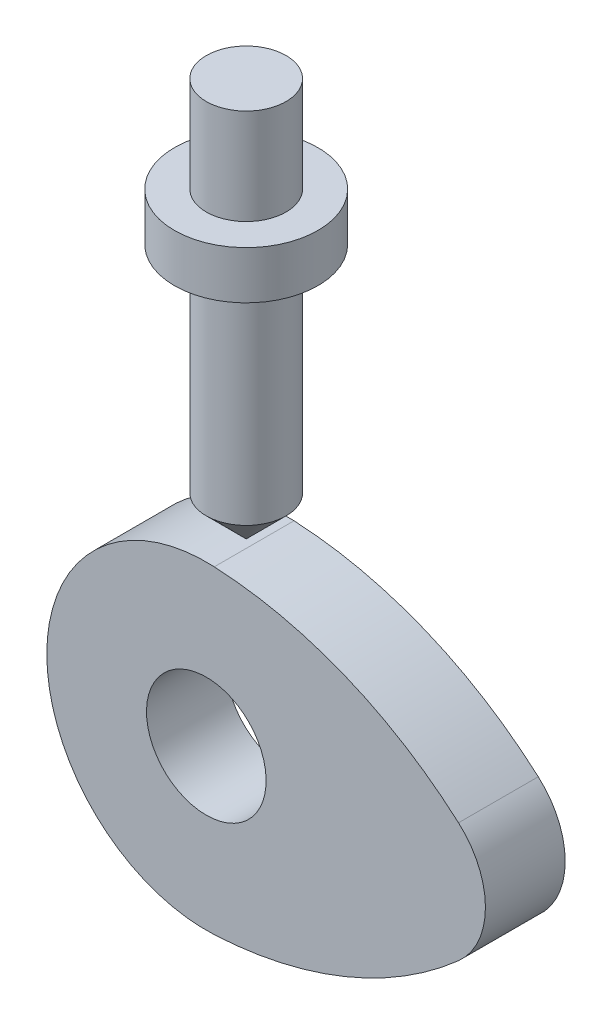
ISO-10303-21;
HEADER;
FILE_DESCRIPTION(('STEP AP214'),'2;1');
FILE_NAME('part.step','',(''),(''),'','','');
FILE_SCHEMA(('AUTOMOTIVE_DESIGN { 1 0 10303 214 1 1 1 1 }'));
ENDSEC;
DATA;
#1=APPLICATION_CONTEXT('core data for automotive mechanical design processes');
#2=APPLICATION_PROTOCOL_DEFINITION('international standard','automotive_design',2000,#1);
#3=PRODUCT_CONTEXT('',#1,'mechanical');
#4=PRODUCT('Part','Part','',(#3));
#5=PRODUCT_RELATED_PRODUCT_CATEGORY('part','',(#4));
#6=PRODUCT_DEFINITION_FORMATION('','',#4);
#7=PRODUCT_DEFINITION_CONTEXT('part definition',#1,'design');
#8=PRODUCT_DEFINITION('design','',#6,#7);
#9=PRODUCT_DEFINITION_SHAPE('','',#8);
#10=(LENGTH_UNIT() NAMED_UNIT(*) SI_UNIT(.MILLI.,.METRE.));
#11=(NAMED_UNIT(*) PLANE_ANGLE_UNIT() SI_UNIT($,.RADIAN.));
#12=(NAMED_UNIT(*) SI_UNIT($,.STERADIAN.) SOLID_ANGLE_UNIT());
#13=UNCERTAINTY_MEASURE_WITH_UNIT(LENGTH_MEASURE(1.E-05),#10,'distance_accuracy_value','');
#14=(GEOMETRIC_REPRESENTATION_CONTEXT(3) GLOBAL_UNCERTAINTY_ASSIGNED_CONTEXT((#13)) GLOBAL_UNIT_ASSIGNED_CONTEXT((#10,
#11,#12)) REPRESENTATION_CONTEXT('',''));
#15=CARTESIAN_POINT('',(0.,0.,0.));
#16=DIRECTION('',(0.,0.,1.));
#17=DIRECTION('',(1.,0.,0.));
#18=AXIS2_PLACEMENT_3D('',#15,#16,#17);
#19=CARTESIAN_POINT('',(0.,70.,0.));
#20=DIRECTION('',(0.,-1.,0.));
#21=DIRECTION('',(-0.386613677027447,0.,-0.922241760459435));
#22=AXIS2_PLACEMENT_3D('',#19,#20,#21);
#23=CYLINDRICAL_SURFACE('',#22,5.);
#24=CARTESIAN_POINT('',(0.,25.,0.));
#25=DIRECTION('',(0.,1.,0.));
#26=DIRECTION('',(0.386613677027447,0.,0.922241760459435));
#27=AXIS2_PLACEMENT_3D('',#24,#25,#26);
#28=CIRCLE('',#27,5.);
#29=CARTESIAN_POINT('',(1.93306838513718,25.,4.61120880229723));
#30=VERTEX_POINT('',#29);
#31=EDGE_CURVE('P0_E11',#30,#30,#28,.T.);
#32=ORIENTED_EDGE('',*,*,#31,.T.);
#33=EDGE_LOOP('',(#32));
#34=FACE_BOUND('',#33,.T.);
#35=CARTESIAN_POINT('',(0.,70.,0.));
#36=DIRECTION('',(0.,1.,0.));
#37=DIRECTION('',(0.386613677027447,0.,0.922241760459435));
#38=AXIS2_PLACEMENT_3D('',#35,#36,#37);
#39=CIRCLE('',#38,5.);
#40=CARTESIAN_POINT('',(1.93306838513718,70.,4.61120880229723));
#41=VERTEX_POINT('',#40);
#42=EDGE_CURVE('P0_E25',#41,#41,#39,.T.);
#43=ORIENTED_EDGE('',*,*,#42,.F.);
#44=EDGE_LOOP('',(#43));
#45=FACE_BOUND('',#44,.T.);
#46=ADVANCED_FACE('P0_F17',(#34,#45),#23,.T.);
#47=CARTESIAN_POINT('',(0.,70.,0.));
#48=DIRECTION('',(0.,1.,0.));
#49=DIRECTION('',(0.386613677027447,0.,0.922241760459435));
#50=AXIS2_PLACEMENT_3D('',#47,#48,#49);
#51=PLANE('',#50);
#52=ORIENTED_EDGE('',*,*,#42,.T.);
#53=EDGE_LOOP('',(#52));
#54=FACE_BOUND('',#53,.T.);
#55=ADVANCED_FACE('P0_F30',(#54),#51,.T.);
#56=CARTESIAN_POINT('',(0.,25.,0.));
#57=DIRECTION('',(0.,1.,0.));
#58=DIRECTION('',(0.386613677027447,0.,0.922241760459435));
#59=AXIS2_PLACEMENT_3D('',#56,#57,#58);
#60=CONICAL_SURFACE('',#59,5.00000000000003,0.78539816339745);
#61=CARTESIAN_POINT('',(0.,20.,0.));
#62=VERTEX_POINT('',#61);
#63=VERTEX_LOOP('',#62);
#64=FACE_BOUND('',#63,.T.);
#65=ORIENTED_EDGE('',*,*,#31,.F.);
#66=EDGE_LOOP('',(#65));
#67=FACE_BOUND('',#66,.T.);
#68=ADVANCED_FACE('P0_F20',(#64,#67),#60,.T.);
#69=CLOSED_SHELL('',(#46,#55,#68));
#70=MANIFOLD_SOLID_BREP('P0_B1',#69);
#71=CARTESIAN_POINT('',(0.,58.,0.));
#72=DIRECTION('',(0.,1.,0.));
#73=DIRECTION('',(0.,0.,1.));
#74=AXIS2_PLACEMENT_3D('',#71,#72,#73);
#75=PLANE('',#74);
#76=CARTESIAN_POINT('',(0.,58.,0.));
#77=DIRECTION('',(0.,1.,0.));
#78=DIRECTION('',(0.,0.,1.));
#79=AXIS2_PLACEMENT_3D('',#76,#77,#78);
#80=CIRCLE('',#79,9.);
#81=CARTESIAN_POINT('',(0.,58.,9.));
#82=VERTEX_POINT('',#81);
#83=EDGE_CURVE('P1_E9',#82,#82,#80,.T.);
#84=ORIENTED_EDGE('',*,*,#83,.T.);
#85=EDGE_LOOP('',(#84));
#86=FACE_BOUND('',#85,.T.);
#87=CARTESIAN_POINT('',(0.,58.,0.));
#88=DIRECTION('',(0.,1.,0.));
#89=DIRECTION('',(0.,0.,1.));
#90=AXIS2_PLACEMENT_3D('',#87,#88,#89);
#91=CIRCLE('',#90,5.);
#92=CARTESIAN_POINT('',(0.,58.,5.));
#93=VERTEX_POINT('',#92);
#94=EDGE_CURVE('P1_E25',#93,#93,#91,.T.);
#95=ORIENTED_EDGE('',*,*,#94,.F.);
#96=EDGE_LOOP('',(#95));
#97=FACE_BOUND('',#96,.T.);
#98=ADVANCED_FACE('P1_F14',(#86,#97),#75,.T.);
#99=CARTESIAN_POINT('',(0.,52.,0.));
#100=DIRECTION('',(0.,1.,0.));
#101=DIRECTION('',(0.,0.,1.));
#102=AXIS2_PLACEMENT_3D('',#99,#100,#101);
#103=PLANE('',#102);
#104=CARTESIAN_POINT('',(0.,52.,0.));
#105=DIRECTION('',(0.,1.,0.));
#106=DIRECTION('',(0.,0.,1.));
#107=AXIS2_PLACEMENT_3D('',#104,#105,#106);
#108=CIRCLE('',#107,9.);
#109=CARTESIAN_POINT('',(0.,52.,9.));
#110=VERTEX_POINT('',#109);
#111=EDGE_CURVE('P1_E18',#110,#110,#108,.T.);
#112=ORIENTED_EDGE('',*,*,#111,.F.);
#113=EDGE_LOOP('',(#112));
#114=FACE_BOUND('',#113,.T.);
#115=CARTESIAN_POINT('',(0.,52.,0.));
#116=DIRECTION('',(0.,1.,0.));
#117=DIRECTION('',(0.,0.,1.));
#118=AXIS2_PLACEMENT_3D('',#115,#116,#117);
#119=CIRCLE('',#118,5.);
#120=CARTESIAN_POINT('',(0.,52.,5.));
#121=VERTEX_POINT('',#120);
#122=EDGE_CURVE('P1_E27',#121,#121,#119,.T.);
#123=ORIENTED_EDGE('',*,*,#122,.T.);
#124=EDGE_LOOP('',(#123));
#125=FACE_BOUND('',#124,.T.);
#126=ADVANCED_FACE('P1_F37',(#114,#125),#103,.F.);
#127=CARTESIAN_POINT('',(0.,58.,0.));
#128=DIRECTION('',(0.,-1.,0.));
#129=DIRECTION('',(0.,0.,-1.));
#130=AXIS2_PLACEMENT_3D('',#127,#128,#129);
#131=CYLINDRICAL_SURFACE('',#130,9.);
#132=ORIENTED_EDGE('',*,*,#83,.F.);
#133=EDGE_LOOP('',(#132));
#134=FACE_BOUND('',#133,.T.);
#135=ORIENTED_EDGE('',*,*,#111,.T.);
#136=EDGE_LOOP('',(#135));
#137=FACE_BOUND('',#136,.T.);
#138=ADVANCED_FACE('P1_F16',(#134,#137),#131,.T.);
#139=CARTESIAN_POINT('',(0.,58.,0.));
#140=DIRECTION('',(0.,-1.,0.));
#141=DIRECTION('',(0.,0.,-1.));
#142=AXIS2_PLACEMENT_3D('',#139,#140,#141);
#143=CYLINDRICAL_SURFACE('',#142,5.);
#144=ORIENTED_EDGE('',*,*,#94,.T.);
#145=EDGE_LOOP('',(#144));
#146=FACE_BOUND('',#145,.T.);
#147=ORIENTED_EDGE('',*,*,#122,.F.);
#148=EDGE_LOOP('',(#147));
#149=FACE_BOUND('',#148,.T.);
#150=ADVANCED_FACE('P1_F33',(#146,#149),#143,.F.);
#151=CLOSED_SHELL('',(#98,#126,#138,#150));
#152=MANIFOLD_SOLID_BREP('P1_B1',#151);
#153=CARTESIAN_POINT('',(11.75,-14.9812382665786,5.));
#154=DIRECTION('',(0.,0.,-1.));
#155=DIRECTION('',(0.,1.,0.));
#156=AXIS2_PLACEMENT_3D('',#153,#154,#155);
#157=PLANE('',#156);
#158=CARTESIAN_POINT('',(-1.5,-29.9624765331573,5.));
#159=DIRECTION('',(0.,0.,1.));
#160=DIRECTION('',(0.,1.,0.));
#161=AXIS2_PLACEMENT_3D('',#158,#159,#160);
#162=CIRCLE('',#161,50.);
#163=CARTESIAN_POINT('',(31.625,7.49061913328932,5.));
#164=VERTEX_POINT('',#163);
#165=CARTESIAN_POINT('',(1.,19.9749843554382,5.));
#166=VERTEX_POINT('',#165);
#167=EDGE_CURVE('P2_E69',#164,#166,#162,.T.);
#168=ORIENTED_EDGE('',*,*,#167,.T.);
#169=CARTESIAN_POINT('',(0.,0.,5.));
#170=DIRECTION('',(0.,0.,1.));
#171=DIRECTION('',(0.,-1.,0.));
#172=AXIS2_PLACEMENT_3D('',#169,#170,#171);
#173=CIRCLE('',#172,20.);
#174=CARTESIAN_POINT('',(1.00000000000001,-19.9749843554382,5.));
#175=VERTEX_POINT('',#174);
#176=EDGE_CURVE('P2_E64',#166,#175,#173,.T.);
#177=ORIENTED_EDGE('',*,*,#176,.T.);
#178=CARTESIAN_POINT('',(-1.5,29.9624765331573,5.));
#179=DIRECTION('',(0.,0.,1.));
#180=DIRECTION('',(0.,-1.,0.));
#181=AXIS2_PLACEMENT_3D('',#178,#179,#180);
#182=CIRCLE('',#181,50.);
#183=CARTESIAN_POINT('',(31.625,-7.49061913328933,5.));
#184=VERTEX_POINT('',#183);
#185=EDGE_CURVE('P2_E67',#175,#184,#182,.T.);
#186=ORIENTED_EDGE('',*,*,#185,.T.);
#187=CARTESIAN_POINT('',(25.,0.,5.));
#188=DIRECTION('',(0.,0.,1.));
#189=DIRECTION('',(0.,-1.,0.));
#190=AXIS2_PLACEMENT_3D('',#187,#188,#189);
#191=CIRCLE('',#190,10.);
#192=EDGE_CURVE('P2_E34',#184,#164,#191,.T.);
#193=ORIENTED_EDGE('',*,*,#192,.T.);
#194=EDGE_LOOP('',(#168,#177,#186,#193));
#195=FACE_BOUND('',#194,.T.);
#196=CARTESIAN_POINT('',(0.,0.,5.));
#197=DIRECTION('',(0.,0.,1.));
#198=DIRECTION('',(0.,-1.,0.));
#199=AXIS2_PLACEMENT_3D('',#196,#197,#198);
#200=CIRCLE('',#199,7.5);
#201=CARTESIAN_POINT('',(0.,-7.5,5.));
#202=VERTEX_POINT('',#201);
#203=EDGE_CURVE('P2_E84',#202,#202,#200,.T.);
#204=ORIENTED_EDGE('',*,*,#203,.F.);
#205=EDGE_LOOP('',(#204));
#206=FACE_BOUND('',#205,.T.);
#207=ADVANCED_FACE('P2_F17',(#195,#206),#157,.F.);
#208=CARTESIAN_POINT('',(11.75,-14.9812382665786,-5.));
#209=DIRECTION('',(0.,0.,-1.));
#210=DIRECTION('',(0.,1.,0.));
#211=AXIS2_PLACEMENT_3D('',#208,#209,#210);
#212=PLANE('',#211);
#213=CARTESIAN_POINT('',(-1.5,-29.9624765331573,-5.));
#214=DIRECTION('',(0.,0.,1.));
#215=DIRECTION('',(0.,1.,0.));
#216=AXIS2_PLACEMENT_3D('',#213,#214,#215);
#217=CIRCLE('',#216,50.);
#218=CARTESIAN_POINT('',(31.625,7.49061913328932,-5.));
#219=VERTEX_POINT('',#218);
#220=CARTESIAN_POINT('',(1.,19.9749843554382,-5.));
#221=VERTEX_POINT('',#220);
#222=EDGE_CURVE('P2_E81',#219,#221,#217,.T.);
#223=ORIENTED_EDGE('',*,*,#222,.F.);
#224=CARTESIAN_POINT('',(25.,0.,-5.));
#225=DIRECTION('',(0.,0.,1.));
#226=DIRECTION('',(0.,-1.,0.));
#227=AXIS2_PLACEMENT_3D('',#224,#225,#226);
#228=CIRCLE('',#227,10.);
#229=CARTESIAN_POINT('',(31.625,-7.49061913328933,-5.));
#230=VERTEX_POINT('',#229);
#231=EDGE_CURVE('P2_E57',#230,#219,#228,.T.);
#232=ORIENTED_EDGE('',*,*,#231,.F.);
#233=CARTESIAN_POINT('',(-1.5,29.9624765331573,-5.));
#234=DIRECTION('',(0.,0.,1.));
#235=DIRECTION('',(0.,-1.,0.));
#236=AXIS2_PLACEMENT_3D('',#233,#234,#235);
#237=CIRCLE('',#236,50.);
#238=CARTESIAN_POINT('',(1.00000000000001,-19.9749843554382,-5.));
#239=VERTEX_POINT('',#238);
#240=EDGE_CURVE('P2_E51',#239,#230,#237,.T.);
#241=ORIENTED_EDGE('',*,*,#240,.F.);
#242=CARTESIAN_POINT('',(0.,0.,-5.));
#243=DIRECTION('',(0.,0.,1.));
#244=DIRECTION('',(0.,-1.,0.));
#245=AXIS2_PLACEMENT_3D('',#242,#243,#244);
#246=CIRCLE('',#245,20.);
#247=EDGE_CURVE('P2_E73',#221,#239,#246,.T.);
#248=ORIENTED_EDGE('',*,*,#247,.F.);
#249=EDGE_LOOP('',(#223,#232,#241,#248));
#250=FACE_BOUND('',#249,.T.);
#251=CARTESIAN_POINT('',(0.,0.,-5.));
#252=DIRECTION('',(0.,0.,1.));
#253=DIRECTION('',(0.,-1.,0.));
#254=AXIS2_PLACEMENT_3D('',#251,#252,#253);
#255=CIRCLE('',#254,7.5);
#256=CARTESIAN_POINT('',(0.,-7.5,-5.));
#257=VERTEX_POINT('',#256);
#258=EDGE_CURVE('P2_E96',#257,#257,#255,.T.);
#259=ORIENTED_EDGE('',*,*,#258,.T.);
#260=EDGE_LOOP('',(#259));
#261=FACE_BOUND('',#260,.T.);
#262=ADVANCED_FACE('P2_F92',(#250,#261),#212,.T.);
#263=CARTESIAN_POINT('',(-1.5,-29.9624765331573,5.));
#264=DIRECTION('',(0.,0.,-1.));
#265=DIRECTION('',(0.,1.,0.));
#266=AXIS2_PLACEMENT_3D('',#263,#264,#265);
#267=CYLINDRICAL_SURFACE('',#266,50.);
#268=ORIENTED_EDGE('',*,*,#222,.T.);
#269=DIRECTION('',(0.,0.,-1.));
#270=VECTOR('',#269,1.);
#271=CARTESIAN_POINT('',(1.,19.9749843554382,5.));
#272=LINE('',#271,#270);
#273=EDGE_CURVE('P2_E11',#166,#221,#272,.T.);
#274=ORIENTED_EDGE('',*,*,#273,.F.);
#275=ORIENTED_EDGE('',*,*,#167,.F.);
#276=DIRECTION('',(0.,0.,-1.));
#277=VECTOR('',#276,1.);
#278=CARTESIAN_POINT('',(31.625,7.49061913328932,5.));
#279=LINE('',#278,#277);
#280=EDGE_CURVE('P2_E77',#164,#219,#279,.T.);
#281=ORIENTED_EDGE('',*,*,#280,.T.);
#282=EDGE_LOOP('',(#268,#274,#275,#281));
#283=FACE_BOUND('',#282,.T.);
#284=ADVANCED_FACE('P2_F19',(#283),#267,.T.);
#285=CARTESIAN_POINT('',(0.,0.,5.));
#286=DIRECTION('',(0.,0.,-1.));
#287=DIRECTION('',(0.,1.,0.));
#288=AXIS2_PLACEMENT_3D('',#285,#286,#287);
#289=CYLINDRICAL_SURFACE('',#288,20.);
#290=ORIENTED_EDGE('',*,*,#247,.T.);
#291=DIRECTION('',(0.,0.,-1.));
#292=VECTOR('',#291,1.);
#293=CARTESIAN_POINT('',(1.00000000000001,-19.9749843554382,5.));
#294=LINE('',#293,#292);
#295=EDGE_CURVE('P2_E26',#175,#239,#294,.T.);
#296=ORIENTED_EDGE('',*,*,#295,.F.);
#297=ORIENTED_EDGE('',*,*,#176,.F.);
#298=ORIENTED_EDGE('',*,*,#273,.T.);
#299=EDGE_LOOP('',(#290,#296,#297,#298));
#300=FACE_BOUND('',#299,.T.);
#301=ADVANCED_FACE('P2_F72',(#300),#289,.T.);
#302=CARTESIAN_POINT('',(-1.5,29.9624765331573,5.));
#303=DIRECTION('',(0.,0.,-1.));
#304=DIRECTION('',(0.,1.,0.));
#305=AXIS2_PLACEMENT_3D('',#302,#303,#304);
#306=CYLINDRICAL_SURFACE('',#305,50.);
#307=ORIENTED_EDGE('',*,*,#240,.T.);
#308=DIRECTION('',(0.,0.,-1.));
#309=VECTOR('',#308,1.);
#310=CARTESIAN_POINT('',(31.625,-7.49061913328933,5.));
#311=LINE('',#310,#309);
#312=EDGE_CURVE('P2_E74',#184,#230,#311,.T.);
#313=ORIENTED_EDGE('',*,*,#312,.F.);
#314=ORIENTED_EDGE('',*,*,#185,.F.);
#315=ORIENTED_EDGE('',*,*,#295,.T.);
#316=EDGE_LOOP('',(#307,#313,#314,#315));
#317=FACE_BOUND('',#316,.T.);
#318=ADVANCED_FACE('P2_F75',(#317),#306,.T.);
#319=CARTESIAN_POINT('',(25.,0.,5.));
#320=DIRECTION('',(0.,0.,-1.));
#321=DIRECTION('',(0.,1.,0.));
#322=AXIS2_PLACEMENT_3D('',#319,#320,#321);
#323=CYLINDRICAL_SURFACE('',#322,10.);
#324=ORIENTED_EDGE('',*,*,#231,.T.);
#325=ORIENTED_EDGE('',*,*,#280,.F.);
#326=ORIENTED_EDGE('',*,*,#192,.F.);
#327=ORIENTED_EDGE('',*,*,#312,.T.);
#328=EDGE_LOOP('',(#324,#325,#326,#327));
#329=FACE_BOUND('',#328,.T.);
#330=ADVANCED_FACE('P2_F89',(#329),#323,.T.);
#331=CARTESIAN_POINT('',(0.,0.,5.));
#332=DIRECTION('',(0.,0.,-1.));
#333=DIRECTION('',(0.,1.,0.));
#334=AXIS2_PLACEMENT_3D('',#331,#332,#333);
#335=CYLINDRICAL_SURFACE('',#334,7.5);
#336=ORIENTED_EDGE('',*,*,#203,.T.);
#337=EDGE_LOOP('',(#336));
#338=FACE_BOUND('',#337,.T.);
#339=ORIENTED_EDGE('',*,*,#258,.F.);
#340=EDGE_LOOP('',(#339));
#341=FACE_BOUND('',#340,.T.);
#342=ADVANCED_FACE('P2_F102',(#338,#341),#335,.F.);
#343=CLOSED_SHELL('',(#207,#262,#284,#301,#318,#330,#342));
#344=MANIFOLD_SOLID_BREP('P2_B1',#343);
#345=ADVANCED_BREP_SHAPE_REPRESENTATION('',(#18,#70,#152,#344),#14);
#346=SHAPE_DEFINITION_REPRESENTATION(#9,#345);
ENDSEC;
END-ISO-10303-21;
